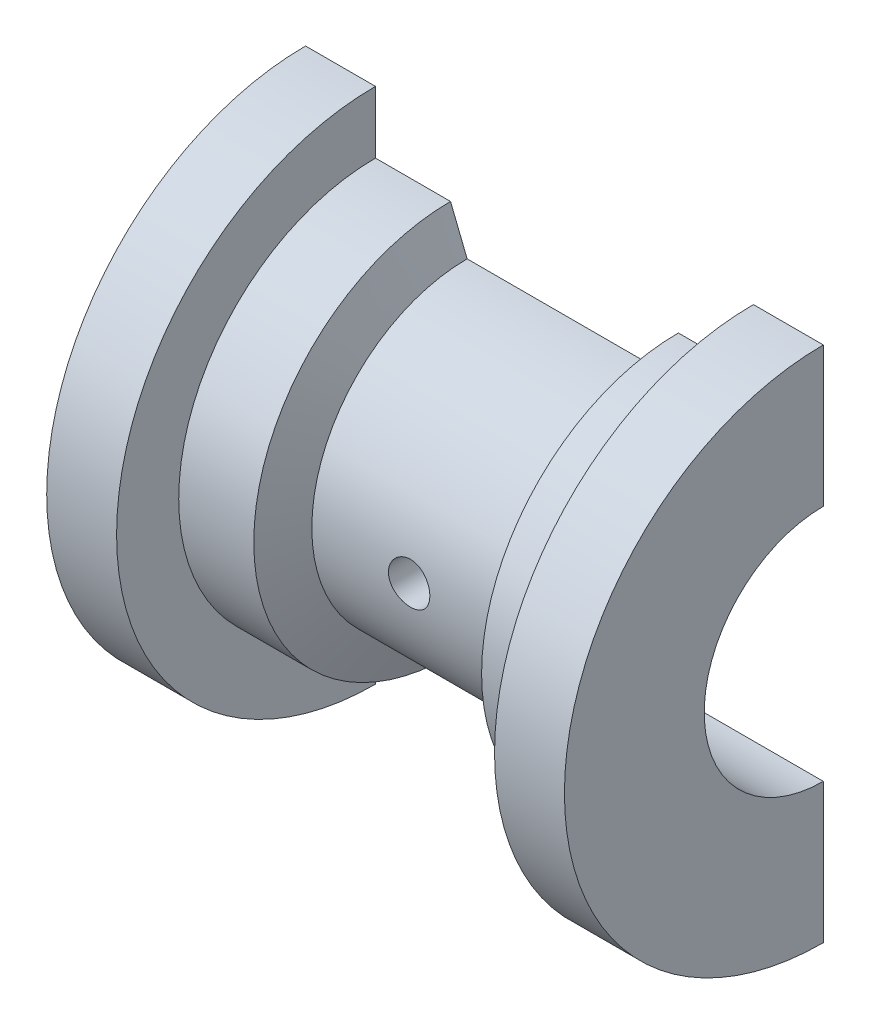
ISO-10303-21;
HEADER;
FILE_DESCRIPTION(('STEP AP214'),'2;1');
FILE_NAME('part.step','',(''),(''),'','','');
FILE_SCHEMA(('AUTOMOTIVE_DESIGN { 1 0 10303 214 1 1 1 1 }'));
ENDSEC;
DATA;
#1=APPLICATION_CONTEXT('core data for automotive mechanical design processes');
#2=APPLICATION_PROTOCOL_DEFINITION('international standard','automotive_design',2000,#1);
#3=PRODUCT_CONTEXT('',#1,'mechanical');
#4=PRODUCT('Part','Part','',(#3));
#5=PRODUCT_RELATED_PRODUCT_CATEGORY('part','',(#4));
#6=PRODUCT_DEFINITION_FORMATION('','',#4);
#7=PRODUCT_DEFINITION_CONTEXT('part definition',#1,'design');
#8=PRODUCT_DEFINITION('design','',#6,#7);
#9=PRODUCT_DEFINITION_SHAPE('','',#8);
#10=(LENGTH_UNIT() NAMED_UNIT(*) SI_UNIT(.MILLI.,.METRE.));
#11=(NAMED_UNIT(*) PLANE_ANGLE_UNIT() SI_UNIT($,.RADIAN.));
#12=(NAMED_UNIT(*) SI_UNIT($,.STERADIAN.) SOLID_ANGLE_UNIT());
#13=UNCERTAINTY_MEASURE_WITH_UNIT(LENGTH_MEASURE(1.E-05),#10,'distance_accuracy_value','');
#14=(GEOMETRIC_REPRESENTATION_CONTEXT(3) GLOBAL_UNCERTAINTY_ASSIGNED_CONTEXT((#13)) GLOBAL_UNIT_ASSIGNED_CONTEXT((#10,
#11,#12)) REPRESENTATION_CONTEXT('',''));
#15=CARTESIAN_POINT('',(0.,0.,0.));
#16=DIRECTION('',(0.,0.,1.));
#17=DIRECTION('',(1.,0.,0.));
#18=AXIS2_PLACEMENT_3D('',#15,#16,#17);
#19=CARTESIAN_POINT('',(-47.2880304249042,0.,0.));
#20=DIRECTION('',(-1.,0.,0.));
#21=DIRECTION('',(0.,0.,1.));
#22=AXIS2_PLACEMENT_3D('',#19,#20,#21);
#23=CYLINDRICAL_SURFACE('',#22,25.);
#24=CARTESIAN_POINT('',(-19.8823412124804,0.,0.));
#25=DIRECTION('',(-1.,0.,0.));
#26=DIRECTION('',(0.,0.,1.));
#27=AXIS2_PLACEMENT_3D('',#24,#25,#26);
#28=CIRCLE('',#27,25.);
#29=CARTESIAN_POINT('',(-19.8823412124804,-25.,-1.74574066942157E-13));
#30=VERTEX_POINT('',#29);
#31=CARTESIAN_POINT('',(-19.8823412124804,25.,0.));
#32=VERTEX_POINT('',#31);
#33=EDGE_CURVE('E46',#30,#32,#28,.T.);
#34=ORIENTED_EDGE('',*,*,#33,.F.);
#35=DIRECTION('',(-1.,0.,0.));
#36=VECTOR('',#35,1.);
#37=CARTESIAN_POINT('',(-13.1323412124804,-25.,-1.74574066942157E-13));
#38=LINE('',#37,#36);
#39=CARTESIAN_POINT('',(-13.1323412124804,-25.,-1.74574066942157E-13));
#40=VERTEX_POINT('',#39);
#41=EDGE_CURVE('E177',#40,#30,#38,.T.);
#42=ORIENTED_EDGE('',*,*,#41,.F.);
#43=CARTESIAN_POINT('',(-13.1323412124804,0.,0.));
#44=DIRECTION('',(-1.,0.,0.));
#45=DIRECTION('',(0.,0.,1.));
#46=AXIS2_PLACEMENT_3D('',#43,#44,#45);
#47=CIRCLE('',#46,25.);
#48=CARTESIAN_POINT('',(-13.1323412124804,25.,0.));
#49=VERTEX_POINT('',#48);
#50=EDGE_CURVE('E53',#40,#49,#47,.T.);
#51=ORIENTED_EDGE('',*,*,#50,.T.);
#52=DIRECTION('',(-1.,0.,0.));
#53=VECTOR('',#52,1.);
#54=CARTESIAN_POINT('',(-13.1323412124804,25.,0.));
#55=LINE('',#54,#53);
#56=EDGE_CURVE('E139',#49,#32,#55,.T.);
#57=ORIENTED_EDGE('',*,*,#56,.T.);
#58=EDGE_LOOP('',(#34,#42,#51,#57));
#59=FACE_BOUND('',#58,.T.);
#60=ADVANCED_FACE('F33',(#59),#23,.T.);
#61=CARTESIAN_POINT('',(-19.8823412124804,-25.,-1.74574066942157E-13));
#62=DIRECTION('',(1.,0.,0.));
#63=DIRECTION('',(0.,0.,-1.));
#64=AXIS2_PLACEMENT_3D('',#61,#62,#63);
#65=PLANE('',#64);
#66=CARTESIAN_POINT('',(-19.8823412124804,0.,0.));
#67=DIRECTION('',(-1.,0.,0.));
#68=DIRECTION('',(0.,0.,1.));
#69=AXIS2_PLACEMENT_3D('',#66,#67,#68);
#70=CIRCLE('',#69,11.5);
#71=CARTESIAN_POINT('',(-19.8823412124804,-11.5,0.));
#72=VERTEX_POINT('',#71);
#73=CARTESIAN_POINT('',(-19.8823412124804,11.5,0.));
#74=VERTEX_POINT('',#73);
#75=EDGE_CURVE('E137',#72,#74,#70,.T.);
#76=ORIENTED_EDGE('',*,*,#75,.F.);
#77=DIRECTION('',(0.,1.,0.));
#78=VECTOR('',#77,1.);
#79=CARTESIAN_POINT('',(-19.8823412124804,-25.,-1.74574066942157E-13));
#80=LINE('',#79,#78);
#81=EDGE_CURVE('E134',#30,#72,#80,.T.);
#82=ORIENTED_EDGE('',*,*,#81,.F.);
#83=ORIENTED_EDGE('',*,*,#33,.T.);
#84=DIRECTION('',(0.,-1.,0.));
#85=VECTOR('',#84,1.);
#86=CARTESIAN_POINT('',(-19.8823412124804,25.,0.));
#87=LINE('',#86,#85);
#88=EDGE_CURVE('E131',#32,#74,#87,.T.);
#89=ORIENTED_EDGE('',*,*,#88,.T.);
#90=EDGE_LOOP('',(#76,#82,#83,#89));
#91=FACE_BOUND('',#90,.T.);
#92=ADVANCED_FACE('F35',(#91),#65,.F.);
#93=CARTESIAN_POINT('',(-47.2880304249042,0.,0.));
#94=DIRECTION('',(-1.,0.,0.));
#95=DIRECTION('',(0.,0.,1.));
#96=AXIS2_PLACEMENT_3D('',#93,#94,#95);
#97=CYLINDRICAL_SURFACE('',#96,11.5);
#98=CARTESIAN_POINT('',(3.11765878751963,0.,11.5));
#99=CARTESIAN_POINT('',(3.11766318973863,-0.111439987261199,11.4999980464568));
#100=CARTESIAN_POINT('',(3.12700440949487,-0.222938986867312,11.4983633236693));
#101=CARTESIAN_POINT('',(3.16410409405057,-0.442804831006432,11.4919995535027));
#102=CARTESIAN_POINT('',(3.19187902860676,-0.551168784068872,11.4872677390533));
#103=CARTESIAN_POINT('',(3.26497804241117,-0.761552143470366,11.4752400457699));
#104=CARTESIAN_POINT('',(3.31028726275848,-0.863576837092958,11.4679463384169));
#105=CARTESIAN_POINT('',(3.41712865249755,-1.05856414232358,11.4515949757715));
#106=CARTESIAN_POINT('',(3.47865914958846,-1.15152768672068,11.4425375023363));
#107=CARTESIAN_POINT('',(3.61687484499668,-1.32672978916093,11.4235561904614));
#108=CARTESIAN_POINT('',(3.69369546056678,-1.40886074189962,11.4136250881568));
#109=CARTESIAN_POINT('',(3.86001930369727,-1.55913628730681,11.3940708420576));
#110=CARTESIAN_POINT('',(3.94952336681174,-1.62727995780311,11.3844477186031));
#111=CARTESIAN_POINT('',(4.13941979656068,-1.74808334588333,11.366528588387));
#112=CARTESIAN_POINT('',(4.23988147307109,-1.80063562522425,11.3582419618416));
#113=CARTESIAN_POINT('',(4.44837506060609,-1.88807717664308,11.344035410303));
#114=CARTESIAN_POINT('',(4.55640641271972,-1.92296775122102,11.338115310792));
#115=CARTESIAN_POINT('',(4.77582837044887,-1.97375430124635,11.3293847096578));
#116=CARTESIAN_POINT('',(4.88717459006075,-1.98983670158453,11.3265437093043));
#117=CARTESIAN_POINT('',(5.11101853206334,-2.00312861182873,11.3242008268519));
#118=CARTESIAN_POINT('',(5.22351616504977,-2.00033957611786,11.3246986874338));
#119=CARTESIAN_POINT('',(5.44513214844808,-1.97611940396107,11.3289494543522));
#120=CARTESIAN_POINT('',(5.55427428674292,-1.95489854149192,11.332665643951));
#121=CARTESIAN_POINT('',(5.76742513866982,-1.89474747798642,11.3428768092161));
#122=CARTESIAN_POINT('',(5.87143366187736,-1.85581662056814,11.3493718878753));
#123=CARTESIAN_POINT('',(6.07198957721002,-1.76114002578922,11.364448234638));
#124=CARTESIAN_POINT('',(6.16849529577773,-1.70530778219089,11.3730401902522));
#125=CARTESIAN_POINT('',(6.35084791596097,-1.57847462401363,11.3913348970239));
#126=CARTESIAN_POINT('',(6.43669388174421,-1.50747237912897,11.4010377455644));
#127=CARTESIAN_POINT('',(6.59650656836181,-1.35117304022646,11.4206218587533));
#128=CARTESIAN_POINT('',(6.67029705756885,-1.26569571727498,11.4305037623993));
#129=CARTESIAN_POINT('',(6.80251546800484,-1.08347997757355,11.4492115670972));
#130=CARTESIAN_POINT('',(6.860943273235,-0.986741475801935,11.4580374601752));
#131=CARTESIAN_POINT('',(6.96079710372552,-0.784577663905632,11.4736530246222));
#132=CARTESIAN_POINT('',(7.00220663744101,-0.679144045989307,11.4804407191691));
#133=CARTESIAN_POINT('',(7.06668003424832,-0.462673794869466,11.4911994491431));
#134=CARTESIAN_POINT('',(7.08974557024805,-0.351637673576867,11.4951707414126));
#135=CARTESIAN_POINT('',(7.11663518412712,-0.128632340091334,11.4998144246932));
#136=CARTESIAN_POINT('',(7.12070103336124,-0.0166931139492505,11.5005282640865));
#137=CARTESIAN_POINT('',(7.11012175548006,0.206266547102302,11.4986904598945));
#138=CARTESIAN_POINT('',(7.09547741464744,0.317287020424385,11.4961389535331));
#139=CARTESIAN_POINT('',(7.0480945338446,0.534504194826881,11.4880828547161));
#140=CARTESIAN_POINT('',(7.01547657619149,0.640727992646711,11.4825979491405));
#141=CARTESIAN_POINT('',(6.93320156052207,0.846199490198304,11.469287521649));
#142=CARTESIAN_POINT('',(6.88354347632484,0.945446769360287,11.461461858773));
#143=CARTESIAN_POINT('',(6.76805034165885,1.13519201472245,11.4442348843544));
#144=CARTESIAN_POINT('',(6.70206536754916,1.22559739955802,11.4348192425939));
#145=CARTESIAN_POINT('',(6.5559966217983,1.39413850431969,11.4154976873865));
#146=CARTESIAN_POINT('',(6.47591172900627,1.47227324761394,11.4055917349978));
#147=CARTESIAN_POINT('',(6.30282859579014,1.61495889061391,11.3862708192041));
#148=CARTESIAN_POINT('',(6.20969433928328,1.67934587153712,11.376862689564));
#149=CARTESIAN_POINT('',(6.01378974737967,1.79156091519117,11.3597334956488));
#150=CARTESIAN_POINT('',(5.91101973659527,1.83938953549079,11.3520123745704));
#151=CARTESIAN_POINT('',(5.69920506846447,1.91688925721392,11.3391834856491));
#152=CARTESIAN_POINT('',(5.59019019286102,1.9466397793412,11.3340643034392));
#153=CARTESIAN_POINT('',(5.36861334611284,1.98738717284104,11.3269910994359));
#154=CARTESIAN_POINT('',(5.25605171468395,1.99838583477912,11.3250367754396));
#155=CARTESIAN_POINT('',(5.03221502455358,2.00126398709899,11.3245283716057));
#156=CARTESIAN_POINT('',(4.92094330643299,1.99340166065945,11.3259283749265));
#157=CARTESIAN_POINT('',(4.70133229259777,1.95934163174623,11.3318698519737));
#158=CARTESIAN_POINT('',(4.59299298486376,1.93314400443713,11.3364113128219));
#159=CARTESIAN_POINT('',(4.38243510328926,1.86325935923312,11.3481059077653));
#160=CARTESIAN_POINT('',(4.28020829813959,1.81959649949323,11.3552554331514));
#161=CARTESIAN_POINT('',(4.0844893412031,1.71604786277069,11.3713637381662));
#162=CARTESIAN_POINT('',(3.99099768563158,1.65616116491746,11.3803226204872));
#163=CARTESIAN_POINT('',(3.81410214895296,1.52095132463558,11.3991847635828));
#164=CARTESIAN_POINT('',(3.73084406248528,1.44543890180401,11.409098721948));
#165=CARTESIAN_POINT('',(3.57809338403151,1.28151898998877,11.4286704477839));
#166=CARTESIAN_POINT('',(3.50860396618712,1.19310853571196,11.438328155737));
#167=CARTESIAN_POINT('',(3.38487719403575,1.00510213248861,11.4563845579892));
#168=CARTESIAN_POINT('',(3.3307596027248,0.905426380799608,11.4647731402985));
#169=CARTESIAN_POINT('',(3.24012167829006,0.698290141761012,11.4792477236034));
#170=CARTESIAN_POINT('',(3.20358415069739,0.590837379696677,11.4853359732199));
#171=CARTESIAN_POINT('',(3.1569039001498,0.402499760766276,11.4932243439483));
#172=CARTESIAN_POINT('',(3.14221107383722,0.322742139938471,11.4957513793936));
#173=CARTESIAN_POINT('',(3.12258701376595,0.162000059486065,11.499139901069));
#174=CARTESIAN_POINT('',(3.11765558715566,0.0810156241309417,11.5000014202041));
#175=CARTESIAN_POINT('',(3.11765878751963,0.,11.5));
#176=B_SPLINE_CURVE_WITH_KNOTS('',3,(#98,#99,#100,#101,#102,#103,#104,#105,#106,#107,#108,#109,
#110,#111,#112,#113,#114,#115,#116,#117,#118,#119,#120,#121,#122,#123,#124,#125,#126,#127,#128,
#129,#130,#131,#132,#133,#134,#135,#136,#137,#138,#139,#140,#141,#142,#143,#144,#145,#146,#147,
#148,#149,#150,#151,#152,#153,#154,#155,#156,#157,#158,#159,#160,#161,#162,#163,#164,#165,#166,
#167,#168,#169,#170,#171,#172,#173,#174,#175),.UNSPECIFIED.,.T.,.F.,(4,2,2,2,2,2,2,2,2,2,2,2,2,
2,2,2,2,2,2,2,2,2,2,2,2,2,2,2,2,2,2,2,2,2,2,2,2,2,4),(0.,0.334023779028205,0.668346396880414,
1.002386321331,1.33639182204538,1.67349881344175,2.01062802294381,2.35002908862659,
2.68940512080716,3.02538798701145,3.3613449599958,3.69351887233486,4.02570509697098,
4.35962115059283,4.69356649840416,5.0320251979663,5.37048645305,5.70927492479025,
6.04803249667268,6.38246741616022,6.71688828171608,7.049092411327,7.38131655026052,
7.71671261281744,8.05213535634693,8.39135808486807,8.73056938964974,9.06827948936411,
9.40595734022818,9.73903924196995,10.0721197782684,10.4047411773155,10.7373814600237,
11.0743155805132,11.4113272855188,11.7508968407608,12.0901335958935,12.3329699443933,
12.5758014952362),.UNSPECIFIED.);
#177=CARTESIAN_POINT('',(3.11765878751963,0.,11.5));
#178=VERTEX_POINT('',#177);
#179=EDGE_CURVE('E142',#178,#178,#176,.T.);
#180=ORIENTED_EDGE('',*,*,#179,.T.);
#181=EDGE_LOOP('',(#180));
#182=FACE_BOUND('',#181,.T.);
#183=CARTESIAN_POINT('',(30.1176587875196,0.,0.));
#184=DIRECTION('',(-1.,0.,0.));
#185=DIRECTION('',(0.,0.,1.));
#186=AXIS2_PLACEMENT_3D('',#183,#184,#185);
#187=CIRCLE('',#186,11.5);
#188=CARTESIAN_POINT('',(30.1176587875196,-11.5,0.));
#189=VERTEX_POINT('',#188);
#190=CARTESIAN_POINT('',(30.1176587875196,11.5,0.));
#191=VERTEX_POINT('',#190);
#192=EDGE_CURVE('E225',#189,#191,#187,.T.);
#193=ORIENTED_EDGE('',*,*,#192,.F.);
#194=DIRECTION('',(1.,0.,0.));
#195=VECTOR('',#194,1.);
#196=CARTESIAN_POINT('',(-19.8823412124804,-11.5,0.));
#197=LINE('',#196,#195);
#198=EDGE_CURVE('E180',#72,#189,#197,.T.);
#199=ORIENTED_EDGE('',*,*,#198,.F.);
#200=ORIENTED_EDGE('',*,*,#75,.T.);
#201=DIRECTION('',(1.,0.,0.));
#202=VECTOR('',#201,1.);
#203=CARTESIAN_POINT('',(-19.8823412124804,11.5,0.));
#204=LINE('',#203,#202);
#205=EDGE_CURVE('E147',#74,#191,#204,.T.);
#206=ORIENTED_EDGE('',*,*,#205,.T.);
#207=EDGE_LOOP('',(#193,#199,#200,#206));
#208=FACE_BOUND('',#207,.T.);
#209=ADVANCED_FACE('F229',(#182,#208),#97,.F.);
#210=CARTESIAN_POINT('',(30.1176587875196,-11.5,0.));
#211=DIRECTION('',(-1.,0.,0.));
#212=DIRECTION('',(0.,0.,1.));
#213=AXIS2_PLACEMENT_3D('',#210,#211,#212);
#214=PLANE('',#213);
#215=CARTESIAN_POINT('',(30.1176587875196,0.,0.));
#216=DIRECTION('',(-1.,0.,0.));
#217=DIRECTION('',(0.,0.,1.));
#218=AXIS2_PLACEMENT_3D('',#215,#216,#217);
#219=CIRCLE('',#218,25.);
#220=CARTESIAN_POINT('',(30.1176587875196,-25.,-1.74574066942157E-13));
#221=VERTEX_POINT('',#220);
#222=CARTESIAN_POINT('',(30.1176587875196,25.,0.));
#223=VERTEX_POINT('',#222);
#224=EDGE_CURVE('E223',#221,#223,#219,.T.);
#225=ORIENTED_EDGE('',*,*,#224,.F.);
#226=DIRECTION('',(0.,-1.,0.));
#227=VECTOR('',#226,1.);
#228=CARTESIAN_POINT('',(30.1176587875196,-11.5,0.));
#229=LINE('',#228,#227);
#230=EDGE_CURVE('E183',#189,#221,#229,.T.);
#231=ORIENTED_EDGE('',*,*,#230,.F.);
#232=ORIENTED_EDGE('',*,*,#192,.T.);
#233=DIRECTION('',(0.,1.,0.));
#234=VECTOR('',#233,1.);
#235=CARTESIAN_POINT('',(30.1176587875196,11.5,0.));
#236=LINE('',#235,#234);
#237=EDGE_CURVE('E149',#191,#223,#236,.T.);
#238=ORIENTED_EDGE('',*,*,#237,.T.);
#239=EDGE_LOOP('',(#225,#231,#232,#238));
#240=FACE_BOUND('',#239,.T.);
#241=ADVANCED_FACE('F261',(#240),#214,.F.);
#242=CARTESIAN_POINT('',(-47.2880304249042,0.,0.));
#243=DIRECTION('',(-1.,0.,0.));
#244=DIRECTION('',(0.,0.,1.));
#245=AXIS2_PLACEMENT_3D('',#242,#243,#244);
#246=CYLINDRICAL_SURFACE('',#245,25.);
#247=CARTESIAN_POINT('',(23.3676587875196,0.,0.));
#248=DIRECTION('',(-1.,0.,0.));
#249=DIRECTION('',(0.,0.,1.));
#250=AXIS2_PLACEMENT_3D('',#247,#248,#249);
#251=CIRCLE('',#250,25.);
#252=CARTESIAN_POINT('',(23.3676587875196,-25.,-1.74574066942157E-13));
#253=VERTEX_POINT('',#252);
#254=CARTESIAN_POINT('',(23.3676587875196,25.,0.));
#255=VERTEX_POINT('',#254);
#256=EDGE_CURVE('E221',#253,#255,#251,.T.);
#257=ORIENTED_EDGE('',*,*,#256,.F.);
#258=DIRECTION('',(-1.,0.,0.));
#259=VECTOR('',#258,1.);
#260=CARTESIAN_POINT('',(30.1176587875196,-25.,-1.74574066942157E-13));
#261=LINE('',#260,#259);
#262=EDGE_CURVE('E186',#221,#253,#261,.T.);
#263=ORIENTED_EDGE('',*,*,#262,.F.);
#264=ORIENTED_EDGE('',*,*,#224,.T.);
#265=DIRECTION('',(-1.,0.,0.));
#266=VECTOR('',#265,1.);
#267=CARTESIAN_POINT('',(30.1176587875196,25.,0.));
#268=LINE('',#267,#266);
#269=EDGE_CURVE('E155',#223,#255,#268,.T.);
#270=ORIENTED_EDGE('',*,*,#269,.T.);
#271=EDGE_LOOP('',(#257,#263,#264,#270));
#272=FACE_BOUND('',#271,.T.);
#273=ADVANCED_FACE('F259',(#272),#246,.T.);
#274=CARTESIAN_POINT('',(23.3676587875196,-25.,-1.74574066942157E-13));
#275=DIRECTION('',(1.,0.,0.));
#276=DIRECTION('',(0.,0.,-1.));
#277=AXIS2_PLACEMENT_3D('',#274,#275,#276);
#278=PLANE('',#277);
#279=CARTESIAN_POINT('',(23.3676587875196,0.,0.));
#280=DIRECTION('',(-1.,0.,0.));
#281=DIRECTION('',(0.,0.,1.));
#282=AXIS2_PLACEMENT_3D('',#279,#280,#281);
#283=CIRCLE('',#282,19.);
#284=CARTESIAN_POINT('',(23.3676587875196,-19.,-1.32676290876039E-13));
#285=VERTEX_POINT('',#284);
#286=CARTESIAN_POINT('',(23.3676587875196,19.,0.));
#287=VERTEX_POINT('',#286);
#288=EDGE_CURVE('E219',#285,#287,#283,.T.);
#289=ORIENTED_EDGE('',*,*,#288,.F.);
#290=DIRECTION('',(0.,1.,0.));
#291=VECTOR('',#290,1.);
#292=CARTESIAN_POINT('',(23.3676587875196,-25.,-1.74574066942157E-13));
#293=LINE('',#292,#291);
#294=EDGE_CURVE('E189',#253,#285,#293,.T.);
#295=ORIENTED_EDGE('',*,*,#294,.F.);
#296=ORIENTED_EDGE('',*,*,#256,.T.);
#297=DIRECTION('',(0.,-1.,0.));
#298=VECTOR('',#297,1.);
#299=CARTESIAN_POINT('',(23.3676587875196,25.,0.));
#300=LINE('',#299,#298);
#301=EDGE_CURVE('E158',#255,#287,#300,.T.);
#302=ORIENTED_EDGE('',*,*,#301,.T.);
#303=EDGE_LOOP('',(#289,#295,#296,#302));
#304=FACE_BOUND('',#303,.T.);
#305=ADVANCED_FACE('F256',(#304),#278,.F.);
#306=CARTESIAN_POINT('',(-47.2880304249042,0.,0.));
#307=DIRECTION('',(-1.,0.,0.));
#308=DIRECTION('',(0.,0.,1.));
#309=AXIS2_PLACEMENT_3D('',#306,#307,#308);
#310=CYLINDRICAL_SURFACE('',#309,19.);
#311=CARTESIAN_POINT('',(16.1176587875196,0.,0.));
#312=DIRECTION('',(-1.,0.,0.));
#313=DIRECTION('',(0.,0.,1.));
#314=AXIS2_PLACEMENT_3D('',#311,#312,#313);
#315=CIRCLE('',#314,19.);
#316=CARTESIAN_POINT('',(16.1176587875196,-19.,-1.32676290876039E-13));
#317=VERTEX_POINT('',#316);
#318=CARTESIAN_POINT('',(16.1176587875196,19.,0.));
#319=VERTEX_POINT('',#318);
#320=EDGE_CURVE('E217',#317,#319,#315,.T.);
#321=ORIENTED_EDGE('',*,*,#320,.F.);
#322=DIRECTION('',(-1.,0.,0.));
#323=VECTOR('',#322,1.);
#324=CARTESIAN_POINT('',(23.3676587875196,-19.,-1.32676290876039E-13));
#325=LINE('',#324,#323);
#326=EDGE_CURVE('E192',#285,#317,#325,.T.);
#327=ORIENTED_EDGE('',*,*,#326,.F.);
#328=ORIENTED_EDGE('',*,*,#288,.T.);
#329=DIRECTION('',(-1.,0.,0.));
#330=VECTOR('',#329,1.);
#331=CARTESIAN_POINT('',(23.3676587875196,19.,0.));
#332=LINE('',#331,#330);
#333=EDGE_CURVE('E161',#287,#319,#332,.T.);
#334=ORIENTED_EDGE('',*,*,#333,.T.);
#335=EDGE_LOOP('',(#321,#327,#328,#334));
#336=FACE_BOUND('',#335,.T.);
#337=ADVANCED_FACE('F252',(#336),#310,.T.);
#338=CARTESIAN_POINT('',(16.1176587875196,0.,0.));
#339=DIRECTION('',(1.,0.,0.));
#340=DIRECTION('',(0.,0.,-1.));
#341=AXIS2_PLACEMENT_3D('',#338,#339,#340);
#342=CONICAL_SURFACE('',#341,19.,1.18920981207261);
#343=CARTESIAN_POINT('',(14.5126447807327,0.,0.));
#344=DIRECTION('',(-1.,0.,0.));
#345=DIRECTION('',(0.,0.,1.));
#346=AXIS2_PLACEMENT_3D('',#343,#344,#345);
#347=CIRCLE('',#346,15.);
#348=CARTESIAN_POINT('',(14.5126447807327,-15.,-1.04744440165294E-13));
#349=VERTEX_POINT('',#348);
#350=CARTESIAN_POINT('',(14.5126447807327,15.,0.));
#351=VERTEX_POINT('',#350);
#352=EDGE_CURVE('E215',#349,#351,#347,.T.);
#353=ORIENTED_EDGE('',*,*,#352,.F.);
#354=DIRECTION('',(-0.372393342102637,0.928074996300206,0.));
#355=VECTOR('',#354,1.);
#356=CARTESIAN_POINT('',(16.1176587875196,-19.,-1.32676290876039E-13));
#357=LINE('',#356,#355);
#358=EDGE_CURVE('E195',#317,#349,#357,.T.);
#359=ORIENTED_EDGE('',*,*,#358,.F.);
#360=ORIENTED_EDGE('',*,*,#320,.T.);
#361=DIRECTION('',(-0.372393342102637,-0.928074996300206,0.));
#362=VECTOR('',#361,1.);
#363=CARTESIAN_POINT('',(16.1176587875196,19.,0.));
#364=LINE('',#363,#362);
#365=EDGE_CURVE('E164',#319,#351,#364,.T.);
#366=ORIENTED_EDGE('',*,*,#365,.T.);
#367=EDGE_LOOP('',(#353,#359,#360,#366));
#368=FACE_BOUND('',#367,.T.);
#369=ADVANCED_FACE('F247',(#368),#342,.T.);
#370=CARTESIAN_POINT('',(-47.2880304249042,0.,0.));
#371=DIRECTION('',(-1.,0.,0.));
#372=DIRECTION('',(0.,0.,1.));
#373=AXIS2_PLACEMENT_3D('',#370,#371,#372);
#374=CYLINDRICAL_SURFACE('',#373,15.);
#375=CARTESIAN_POINT('',(3.11765878751963,0.,15.));
#376=CARTESIAN_POINT('',(3.11766349722654,0.111808835669284,14.9999983574254));
#377=CARTESIAN_POINT('',(3.1270663254821,0.22368597927628,14.9987367072719));
#378=CARTESIAN_POINT('',(3.16442513656919,0.444322725138079,14.993825111269));
#379=CARTESIAN_POINT('',(3.19240008241678,0.553079022333037,14.9901727244172));
#380=CARTESIAN_POINT('',(3.26606050506108,0.764248312626984,14.9808907984907));
#381=CARTESIAN_POINT('',(3.31173359855807,0.866665683058493,14.9752626421097));
#382=CARTESIAN_POINT('',(3.41946570132591,1.0623638950303,14.9626538666039));
#383=CARTESIAN_POINT('',(3.48152206868609,1.15564620633702,14.9556734655857));
#384=CARTESIAN_POINT('',(3.62067204912381,1.33102582250468,14.9410899478996));
#385=CARTESIAN_POINT('',(3.6978474325281,1.41305798549586,14.9334835816211));
#386=CARTESIAN_POINT('',(3.86486897659629,1.56304735673102,14.9185313755795));
#387=CARTESIAN_POINT('',(3.95471580751544,1.63100381997221,14.9111855496234));
#388=CARTESIAN_POINT('',(4.14495791046466,1.75115902268907,14.8975543544019));
#389=CARTESIAN_POINT('',(4.24539246999826,1.80329607482578,14.8912731776576));
#390=CARTESIAN_POINT('',(4.45368985475642,1.8899384500729,14.8805258737923));
#391=CARTESIAN_POINT('',(4.56155235987294,1.92444453245278,14.8760596685121));
#392=CARTESIAN_POINT('',(4.78096459802129,1.97464606772174,14.8694793656867));
#393=CARTESIAN_POINT('',(4.89248862205255,1.99045204228506,14.8673514537014));
#394=CARTESIAN_POINT('',(5.11662496712558,2.00314680548117,14.8656465160932));
#395=CARTESIAN_POINT('',(5.22923723833053,2.00003645633601,14.866069374204));
#396=CARTESIAN_POINT('',(5.45157991754756,1.97507745939234,14.8694055577299));
#397=CARTESIAN_POINT('',(5.56132431740534,1.95335097531762,14.8723026462234));
#398=CARTESIAN_POINT('',(5.77559562427972,1.89196724634371,14.8802355277475));
#399=CARTESIAN_POINT('',(5.88012241227464,1.85230959261457,14.8852713695413));
#400=CARTESIAN_POINT('',(6.08136842222683,1.75605929143191,14.8969326111103));
#401=CARTESIAN_POINT('',(6.17806215871394,1.69941397913749,14.903562941239));
#402=CARTESIAN_POINT('',(6.36061786943729,1.57083393344289,14.9176623621993));
#403=CARTESIAN_POINT('',(6.4464792800738,1.49889840502385,14.9251314966353));
#404=CARTESIAN_POINT('',(6.60564180010153,1.34110490026362,14.9401389923359));
#405=CARTESIAN_POINT('',(6.67883863022196,1.25514170702645,14.947677435412));
#406=CARTESIAN_POINT('',(6.80978083244802,1.07209417013341,14.9619192381826));
#407=CARTESIAN_POINT('',(6.86752616004315,0.97500979444237,14.9686225954715));
#408=CARTESIAN_POINT('',(6.96592790521437,0.77239221973047,14.9804439374358));
#409=CARTESIAN_POINT('',(7.00657731856594,0.666855578841231,14.9855612720896));
#410=CARTESIAN_POINT('',(7.06954810649198,0.450370924336249,14.9936282590407));
#411=CARTESIAN_POINT('',(7.09187045815903,0.339423199542257,14.9965780268993));
#412=CARTESIAN_POINT('',(7.11741722029075,0.116166903325644,14.9999624137686));
#413=CARTESIAN_POINT('',(7.12078518930312,0.00387503454704316,15.0004159384905));
#414=CARTESIAN_POINT('',(7.10870712339245,-0.219671617218717,14.9988079153852));
#415=CARTESIAN_POINT('',(7.09326154573727,-0.330926425345663,14.996746428686));
#416=CARTESIAN_POINT('',(7.04411413413565,-0.548813715572937,14.990351753581));
#417=CARTESIAN_POINT('',(7.01048121919748,-0.655462016512044,14.9860271430292));
#418=CARTESIAN_POINT('',(6.92598582158254,-0.861605098793559,14.9755900925429));
#419=CARTESIAN_POINT('',(6.87512268150638,-0.961099607015637,14.9694775843944));
#420=CARTESIAN_POINT('',(6.75726663193632,-1.15074887861608,14.9560983737007));
#421=CARTESIAN_POINT('',(6.6901814218063,-1.2408458143966,14.9488251504572));
#422=CARTESIAN_POINT('',(6.54191545829538,-1.4085529469919,14.9339572870998));
#423=CARTESIAN_POINT('',(6.4607340650032,-1.48616257662378,14.9263626324062));
#424=CARTESIAN_POINT('',(6.28594564488008,-1.62720549423098,14.9116490247351));
#425=CARTESIAN_POINT('',(6.19226122078147,-1.69054327608938,14.904533487753));
#426=CARTESIAN_POINT('',(5.99549937723871,-1.80058351078814,14.8916413300182));
#427=CARTESIAN_POINT('',(5.89242216760926,-1.84728633510346,14.8858646793678));
#428=CARTESIAN_POINT('',(5.68010154549194,-1.92257836500746,14.8763281178008));
#429=CARTESIAN_POINT('',(5.57087710230883,-1.95122028846795,14.872562342326));
#430=CARTESIAN_POINT('',(5.34911515539087,-1.98974667143959,14.8674574869829));
#431=CARTESIAN_POINT('',(5.2365778291952,-1.99963213426782,14.8661182773134));
#432=CARTESIAN_POINT('',(5.01233529666613,-2.00034485806189,14.8660223129545));
#433=CARTESIAN_POINT('',(4.90063054655539,-1.99132219194493,14.8672452228252));
#434=CARTESIAN_POINT('',(4.68034091241576,-1.95479376686689,14.872091838742));
#435=CARTESIAN_POINT('',(4.57175602721766,-1.92728801483269,14.8757155438883));
#436=CARTESIAN_POINT('',(4.36081510426805,-1.85462310332207,14.8849489027276));
#437=CARTESIAN_POINT('',(4.25845617640277,-1.80947220819041,14.890557626594));
#438=CARTESIAN_POINT('',(4.06274290369357,-1.70281342759737,14.9031304571282));
#439=CARTESIAN_POINT('',(3.96938873276359,-1.64130522630429,14.910094589966));
#440=CARTESIAN_POINT('',(3.79356913759122,-1.50312448509508,14.9246596718306));
#441=CARTESIAN_POINT('',(3.7111918397645,-1.42634027226901,14.9322650575408));
#442=CARTESIAN_POINT('',(3.56043557115809,-1.26002169349824,14.9472171900166));
#443=CARTESIAN_POINT('',(3.49205988876938,-1.17048434072978,14.9545638756898));
#444=CARTESIAN_POINT('',(3.37099164905311,-0.980752987852823,14.9682063513753));
#445=CARTESIAN_POINT('',(3.31836812096439,-0.880514620743967,14.9744974642689));
#446=CARTESIAN_POINT('',(3.23077818897455,-0.672592409587331,14.9852732065897));
#447=CARTESIAN_POINT('',(3.19579287889477,-0.564916678969891,14.9897597692431));
#448=CARTESIAN_POINT('',(3.15271078113445,-0.380588408098419,14.9953572174327));
#449=CARTESIAN_POINT('',(3.13958554399599,-0.305091081955779,14.9970896363507));
#450=CARTESIAN_POINT('',(3.12205797335416,-0.153073171616112,14.9994115849077));
#451=CARTESIAN_POINT('',(3.11765556290603,-0.0765525964512404,15.000001124628));
#452=CARTESIAN_POINT('',(3.11765878751963,0.,15.));
#453=B_SPLINE_CURVE_WITH_KNOTS('',3,(#375,#376,#377,#378,#379,#380,#381,#382,#383,#384,#385,
#386,#387,#388,#389,#390,#391,#392,#393,#394,#395,#396,#397,#398,#399,#400,#401,#402,#403,#404,
#405,#406,#407,#408,#409,#410,#411,#412,#413,#414,#415,#416,#417,#418,#419,#420,#421,#422,#423,
#424,#425,#426,#427,#428,#429,#430,#431,#432,#433,#434,#435,#436,#437,#438,#439,#440,#441,#442,
#443,#444,#445,#446,#447,#448,#449,#450,#451,#452),.UNSPECIFIED.,.T.,.F.,(4,2,2,2,2,2,2,2,2,2,2,
2,2,2,2,2,2,2,2,2,2,2,2,2,2,2,2,2,2,2,2,2,2,2,2,2,2,2,4),(0.,0.335146851305743,
0.670636430885044,1.0058916928274,1.34109292564034,1.67815978443559,2.01524447904836,
2.35362721511647,2.69199537766205,3.02835355914359,3.3646964092492,3.69884885098043,
4.0330089117585,4.36821583137897,4.70344018443797,5.04130544484849,5.37917167852296,
5.71717620202538,6.05516270391743,6.39058584992061,6.72600084354478,7.06015363396463,
7.39431917503546,7.73043274769884,8.06656158258761,8.4048770453545,8.74318495273048,
9.08050074735454,9.41779849783634,9.75242927496624,10.0870599266875,10.4215340370262,
10.756014605959,11.0930366783511,11.4301378125116,11.7686952667452,12.1068890499242,
12.3363573904731,12.5658237068544),.UNSPECIFIED.);
#454=CARTESIAN_POINT('',(3.11765878751963,0.,15.));
#455=VERTEX_POINT('',#454);
#456=EDGE_CURVE('E11',#455,#455,#453,.T.);
#457=ORIENTED_EDGE('',*,*,#456,.T.);
#458=EDGE_LOOP('',(#457));
#459=FACE_BOUND('',#458,.T.);
#460=CARTESIAN_POINT('',(-4.27732720569345,0.,0.));
#461=DIRECTION('',(-1.,0.,0.));
#462=DIRECTION('',(0.,0.,1.));
#463=AXIS2_PLACEMENT_3D('',#460,#461,#462);
#464=CIRCLE('',#463,15.);
#465=CARTESIAN_POINT('',(-4.27732720569345,-15.,-1.04744440165294E-13));
#466=VERTEX_POINT('',#465);
#467=CARTESIAN_POINT('',(-4.27732720569345,15.,0.));
#468=VERTEX_POINT('',#467);
#469=EDGE_CURVE('E213',#466,#468,#464,.T.);
#470=ORIENTED_EDGE('',*,*,#469,.F.);
#471=DIRECTION('',(-1.,0.,0.));
#472=VECTOR('',#471,1.);
#473=CARTESIAN_POINT('',(14.5126447807327,-15.,-1.04744440165294E-13));
#474=LINE('',#473,#472);
#475=EDGE_CURVE('E198',#349,#466,#474,.T.);
#476=ORIENTED_EDGE('',*,*,#475,.F.);
#477=ORIENTED_EDGE('',*,*,#352,.T.);
#478=DIRECTION('',(-1.,0.,0.));
#479=VECTOR('',#478,1.);
#480=CARTESIAN_POINT('',(14.5126447807327,15.,0.));
#481=LINE('',#480,#479);
#482=EDGE_CURVE('E167',#351,#468,#481,.T.);
#483=ORIENTED_EDGE('',*,*,#482,.T.);
#484=EDGE_LOOP('',(#470,#476,#477,#483));
#485=FACE_BOUND('',#484,.T.);
#486=ADVANCED_FACE('F244',(#459,#485),#374,.T.);
#487=CARTESIAN_POINT('',(-4.27732720569345,0.,0.));
#488=DIRECTION('',(-1.,0.,0.));
#489=DIRECTION('',(0.,0.,1.));
#490=AXIS2_PLACEMENT_3D('',#487,#488,#489);
#491=CONICAL_SURFACE('',#490,15.,1.18920981207261);
#492=CARTESIAN_POINT('',(-5.88234121248037,0.,0.));
#493=DIRECTION('',(-1.,0.,0.));
#494=DIRECTION('',(0.,0.,1.));
#495=AXIS2_PLACEMENT_3D('',#492,#493,#494);
#496=CIRCLE('',#495,19.);
#497=CARTESIAN_POINT('',(-5.88234121248036,-19.,-1.32676290876039E-13));
#498=VERTEX_POINT('',#497);
#499=CARTESIAN_POINT('',(-5.88234121248036,19.,0.));
#500=VERTEX_POINT('',#499);
#501=EDGE_CURVE('E211',#498,#500,#496,.T.);
#502=ORIENTED_EDGE('',*,*,#501,.F.);
#503=DIRECTION('',(-0.372393342102636,-0.928074996300207,0.));
#504=VECTOR('',#503,1.);
#505=CARTESIAN_POINT('',(-5.88234121248036,-19.,-1.32676290876039E-13));
#506=LINE('',#505,#504);
#507=EDGE_CURVE('E201',#466,#498,#506,.T.);
#508=ORIENTED_EDGE('',*,*,#507,.F.);
#509=ORIENTED_EDGE('',*,*,#469,.T.);
#510=DIRECTION('',(-0.372393342102636,0.928074996300207,0.));
#511=VECTOR('',#510,1.);
#512=CARTESIAN_POINT('',(-5.88234121248036,19.,0.));
#513=LINE('',#512,#511);
#514=EDGE_CURVE('E170',#468,#500,#513,.T.);
#515=ORIENTED_EDGE('',*,*,#514,.T.);
#516=EDGE_LOOP('',(#502,#508,#509,#515));
#517=FACE_BOUND('',#516,.T.);
#518=ADVANCED_FACE('F240',(#517),#491,.T.);
#519=CARTESIAN_POINT('',(-47.2880304249042,0.,0.));
#520=DIRECTION('',(-1.,0.,0.));
#521=DIRECTION('',(0.,0.,1.));
#522=AXIS2_PLACEMENT_3D('',#519,#520,#521);
#523=CYLINDRICAL_SURFACE('',#522,19.);
#524=CARTESIAN_POINT('',(-13.1323412124804,0.,0.));
#525=DIRECTION('',(-1.,0.,0.));
#526=DIRECTION('',(0.,0.,1.));
#527=AXIS2_PLACEMENT_3D('',#524,#525,#526);
#528=CIRCLE('',#527,19.);
#529=CARTESIAN_POINT('',(-13.1323412124804,-19.,-1.32676290876039E-13));
#530=VERTEX_POINT('',#529);
#531=CARTESIAN_POINT('',(-13.1323412124804,19.,0.));
#532=VERTEX_POINT('',#531);
#533=EDGE_CURVE('E61',#530,#532,#528,.T.);
#534=ORIENTED_EDGE('',*,*,#533,.F.);
#535=DIRECTION('',(-1.,0.,0.));
#536=VECTOR('',#535,1.);
#537=CARTESIAN_POINT('',(-5.88234121248036,-19.,-1.32676290876039E-13));
#538=LINE('',#537,#536);
#539=EDGE_CURVE('E204',#498,#530,#538,.T.);
#540=ORIENTED_EDGE('',*,*,#539,.F.);
#541=ORIENTED_EDGE('',*,*,#501,.T.);
#542=DIRECTION('',(-1.,0.,0.));
#543=VECTOR('',#542,1.);
#544=CARTESIAN_POINT('',(-5.88234121248036,19.,0.));
#545=LINE('',#544,#543);
#546=EDGE_CURVE('E173',#500,#532,#545,.T.);
#547=ORIENTED_EDGE('',*,*,#546,.T.);
#548=EDGE_LOOP('',(#534,#540,#541,#547));
#549=FACE_BOUND('',#548,.T.);
#550=ADVANCED_FACE('F235',(#549),#523,.T.);
#551=CARTESIAN_POINT('',(-13.1323412124804,-19.,-1.32676290876039E-13));
#552=DIRECTION('',(-1.,0.,0.));
#553=DIRECTION('',(0.,0.,1.));
#554=AXIS2_PLACEMENT_3D('',#551,#552,#553);
#555=PLANE('',#554);
#556=DIRECTION('',(0.,-1.,0.));
#557=VECTOR('',#556,1.);
#558=CARTESIAN_POINT('',(-13.1323412124804,-19.,-1.32676290876039E-13));
#559=LINE('',#558,#557);
#560=EDGE_CURVE('E206',#530,#40,#559,.T.);
#561=ORIENTED_EDGE('',*,*,#560,.F.);
#562=ORIENTED_EDGE('',*,*,#533,.T.);
#563=DIRECTION('',(0.,1.,0.));
#564=VECTOR('',#563,1.);
#565=CARTESIAN_POINT('',(-13.1323412124804,19.,0.));
#566=LINE('',#565,#564);
#567=EDGE_CURVE('E175',#532,#49,#566,.T.);
#568=ORIENTED_EDGE('',*,*,#567,.T.);
#569=ORIENTED_EDGE('',*,*,#50,.F.);
#570=EDGE_LOOP('',(#561,#562,#568,#569));
#571=FACE_BOUND('',#570,.T.);
#572=ADVANCED_FACE('F233',(#571),#555,.F.);
#573=CARTESIAN_POINT('',(0.,0.,0.));
#574=DIRECTION('',(0.,0.,-1.));
#575=DIRECTION('',(1.,0.,0.));
#576=AXIS2_PLACEMENT_3D('',#573,#574,#575);
#577=PLANE('',#576);
#578=ORIENTED_EDGE('',*,*,#41,.T.);
#579=ORIENTED_EDGE('',*,*,#81,.T.);
#580=ORIENTED_EDGE('',*,*,#198,.T.);
#581=ORIENTED_EDGE('',*,*,#230,.T.);
#582=ORIENTED_EDGE('',*,*,#262,.T.);
#583=ORIENTED_EDGE('',*,*,#294,.T.);
#584=ORIENTED_EDGE('',*,*,#326,.T.);
#585=ORIENTED_EDGE('',*,*,#358,.T.);
#586=ORIENTED_EDGE('',*,*,#475,.T.);
#587=ORIENTED_EDGE('',*,*,#507,.T.);
#588=ORIENTED_EDGE('',*,*,#539,.T.);
#589=ORIENTED_EDGE('',*,*,#560,.T.);
#590=EDGE_LOOP('',(#578,#579,#580,#581,#582,#583,#584,#585,#586,#587,#588,#589));
#591=FACE_BOUND('',#590,.T.);
#592=ADVANCED_FACE('F231',(#591),#577,.T.);
#593=CARTESIAN_POINT('',(0.,0.,0.));
#594=DIRECTION('',(0.,0.,1.));
#595=DIRECTION('',(1.,0.,0.));
#596=AXIS2_PLACEMENT_3D('',#593,#594,#595);
#597=PLANE('',#596);
#598=ORIENTED_EDGE('',*,*,#56,.F.);
#599=ORIENTED_EDGE('',*,*,#567,.F.);
#600=ORIENTED_EDGE('',*,*,#546,.F.);
#601=ORIENTED_EDGE('',*,*,#514,.F.);
#602=ORIENTED_EDGE('',*,*,#482,.F.);
#603=ORIENTED_EDGE('',*,*,#365,.F.);
#604=ORIENTED_EDGE('',*,*,#333,.F.);
#605=ORIENTED_EDGE('',*,*,#301,.F.);
#606=ORIENTED_EDGE('',*,*,#269,.F.);
#607=ORIENTED_EDGE('',*,*,#237,.F.);
#608=ORIENTED_EDGE('',*,*,#205,.F.);
#609=ORIENTED_EDGE('',*,*,#88,.F.);
#610=EDGE_LOOP('',(#598,#599,#600,#601,#602,#603,#604,#605,#606,#607,#608,#609));
#611=FACE_BOUND('',#610,.T.);
#612=ADVANCED_FACE('F144',(#611),#597,.F.);
#613=CARTESIAN_POINT('',(5.11765878751963,0.,0.));
#614=DIRECTION('',(0.,0.,-1.));
#615=DIRECTION('',(-1.,0.,0.));
#616=AXIS2_PLACEMENT_3D('',#613,#614,#615);
#617=CYLINDRICAL_SURFACE('',#616,2.);
#618=ORIENTED_EDGE('',*,*,#456,.F.);
#619=EDGE_LOOP('',(#618));
#620=FACE_BOUND('',#619,.T.);
#621=ORIENTED_EDGE('',*,*,#179,.F.);
#622=EDGE_LOOP('',(#621));
#623=FACE_BOUND('',#622,.T.);
#624=ADVANCED_FACE('F333',(#620,#623),#617,.F.);
#625=CLOSED_SHELL('',(#60,#92,#209,#241,#273,#305,#337,#369,#486,#518,#550,#572,#592,#612,#624));
#626=MANIFOLD_SOLID_BREP('B2',#625);
#627=ADVANCED_BREP_SHAPE_REPRESENTATION('',(#18,#626),#14);
#628=SHAPE_DEFINITION_REPRESENTATION(#9,#627);
ENDSEC;
END-ISO-10303-21;
